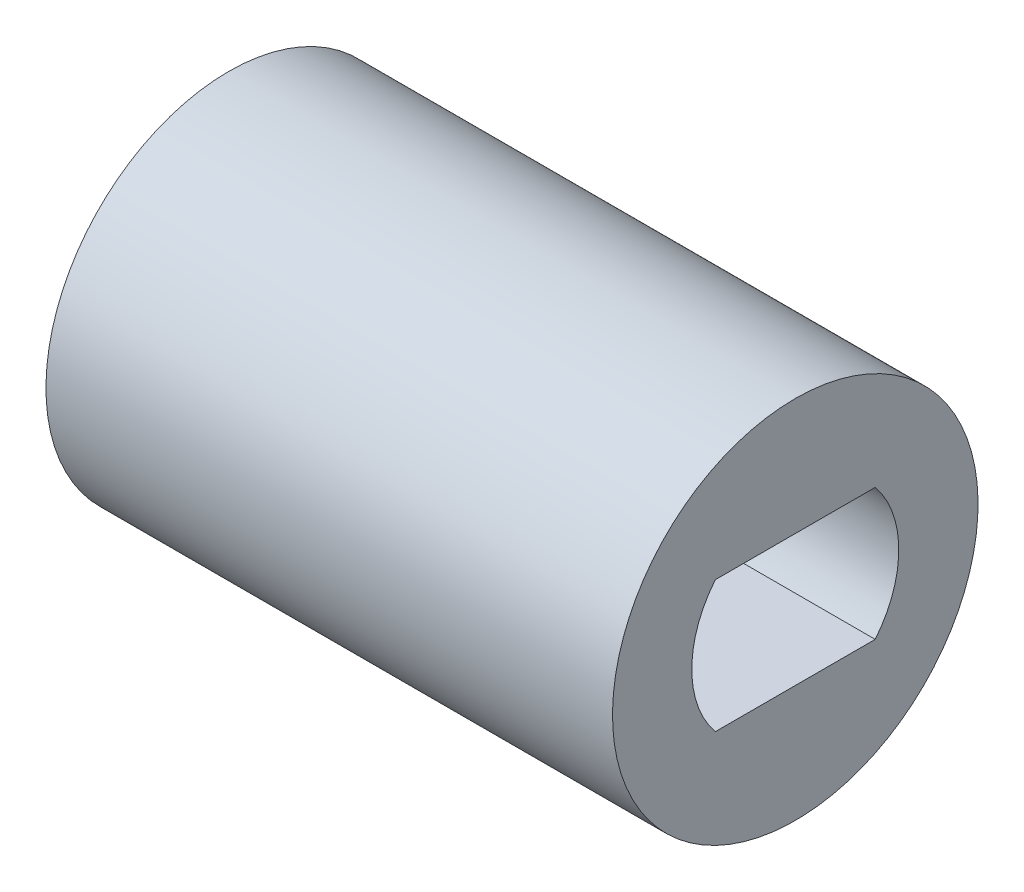
ISO-10303-21;
HEADER;
FILE_DESCRIPTION(('STEP AP214'),'2;1');
FILE_NAME('part.step','',(''),(''),'','','');
FILE_SCHEMA(('AUTOMOTIVE_DESIGN { 1 0 10303 214 1 1 1 1 }'));
ENDSEC;
DATA;
#1=APPLICATION_CONTEXT('core data for automotive mechanical design processes');
#2=APPLICATION_PROTOCOL_DEFINITION('international standard','automotive_design',2000,#1);
#3=PRODUCT_CONTEXT('',#1,'mechanical');
#4=PRODUCT('Part','Part','',(#3));
#5=PRODUCT_RELATED_PRODUCT_CATEGORY('part','',(#4));
#6=PRODUCT_DEFINITION_FORMATION('','',#4);
#7=PRODUCT_DEFINITION_CONTEXT('part definition',#1,'design');
#8=PRODUCT_DEFINITION('design','',#6,#7);
#9=PRODUCT_DEFINITION_SHAPE('','',#8);
#10=(LENGTH_UNIT() NAMED_UNIT(*) SI_UNIT(.MILLI.,.METRE.));
#11=(NAMED_UNIT(*) PLANE_ANGLE_UNIT() SI_UNIT($,.RADIAN.));
#12=(NAMED_UNIT(*) SI_UNIT($,.STERADIAN.) SOLID_ANGLE_UNIT());
#13=UNCERTAINTY_MEASURE_WITH_UNIT(LENGTH_MEASURE(1.E-05),#10,'distance_accuracy_value','');
#14=(GEOMETRIC_REPRESENTATION_CONTEXT(3) GLOBAL_UNCERTAINTY_ASSIGNED_CONTEXT((#13)) GLOBAL_UNIT_ASSIGNED_CONTEXT((#10,
#11,#12)) REPRESENTATION_CONTEXT('',''));
#15=CARTESIAN_POINT('',(0.,0.,0.));
#16=DIRECTION('',(0.,0.,1.));
#17=DIRECTION('',(1.,0.,0.));
#18=AXIS2_PLACEMENT_3D('',#15,#16,#17);
#19=CARTESIAN_POINT('',(60.96,6.35000000000003,0.));
#20=DIRECTION('',(1.,0.,0.));
#21=DIRECTION('',(0.,1.,0.));
#22=AXIS2_PLACEMENT_3D('',#19,#20,#21);
#23=PLANE('',#22);
#24=CARTESIAN_POINT('',(60.96,0.,0.));
#25=DIRECTION('',(1.,0.,0.));
#26=DIRECTION('',(0.,1.,0.));
#27=AXIS2_PLACEMENT_3D('',#24,#25,#26);
#28=CIRCLE('',#27,6.35000000000002);
#29=CARTESIAN_POINT('',(60.96,6.35000000000003,0.));
#30=VERTEX_POINT('',#29);
#31=EDGE_CURVE('E110',#30,#30,#28,.T.);
#32=ORIENTED_EDGE('',*,*,#31,.T.);
#33=EDGE_LOOP('',(#32));
#34=FACE_BOUND('',#33,.T.);
#35=CARTESIAN_POINT('',(60.96,0.,0.));
#36=DIRECTION('',(1.,0.,0.));
#37=DIRECTION('',(0.,0.,-1.));
#38=AXIS2_PLACEMENT_3D('',#35,#36,#37);
#39=CIRCLE('',#38,3.5964868734474);
#40=CARTESIAN_POINT('',(60.96,2.28600000000001,2.77649452203304));
#41=VERTEX_POINT('',#40);
#42=CARTESIAN_POINT('',(60.96,-2.28599999999999,2.77649452203304));
#43=VERTEX_POINT('',#42);
#44=EDGE_CURVE('E103',#41,#43,#39,.T.);
#45=ORIENTED_EDGE('',*,*,#44,.F.);
#46=DIRECTION('',(0.,0.,-1.));
#47=VECTOR('',#46,1.);
#48=CARTESIAN_POINT('',(60.96,2.28600000000001,0.));
#49=LINE('',#48,#47);
#50=CARTESIAN_POINT('',(60.96,2.28600000000001,-2.77649452203304));
#51=VERTEX_POINT('',#50);
#52=EDGE_CURVE('E52',#41,#51,#49,.T.);
#53=ORIENTED_EDGE('',*,*,#52,.T.);
#54=CARTESIAN_POINT('',(60.96,-2.28599999999999,-2.77649452203304));
#55=VERTEX_POINT('',#54);
#56=EDGE_CURVE('E94',#55,#51,#39,.T.);
#57=ORIENTED_EDGE('',*,*,#56,.F.);
#58=DIRECTION('',(0.,0.,-1.));
#59=VECTOR('',#58,1.);
#60=CARTESIAN_POINT('',(60.96,-2.28599999999999,0.));
#61=LINE('',#60,#59);
#62=EDGE_CURVE('E105',#43,#55,#61,.T.);
#63=ORIENTED_EDGE('',*,*,#62,.F.);
#64=EDGE_LOOP('',(#45,#53,#57,#63));
#65=FACE_BOUND('',#64,.T.);
#66=ADVANCED_FACE('F37',(#34,#65),#23,.T.);
#67=CARTESIAN_POINT('',(50.9269999999999,0.,0.));
#68=DIRECTION('',(-1.,0.,0.));
#69=DIRECTION('',(0.,-1.,0.));
#70=AXIS2_PLACEMENT_3D('',#67,#68,#69);
#71=CONICAL_SURFACE('',#70,3.17500000000003,0.785398163397446);
#72=CARTESIAN_POINT('',(54.102,0.,0.));
#73=VERTEX_POINT('',#72);
#74=VERTEX_LOOP('',#73);
#75=FACE_BOUND('',#74,.T.);
#76=CARTESIAN_POINT('',(50.9269999999999,0.,0.));
#77=DIRECTION('',(1.,0.,0.));
#78=DIRECTION('',(0.,1.,0.));
#79=AXIS2_PLACEMENT_3D('',#76,#77,#78);
#80=CIRCLE('',#79,3.17500000000003);
#81=CARTESIAN_POINT('',(50.9269999999999,3.17500000000003,0.));
#82=VERTEX_POINT('',#81);
#83=EDGE_CURVE('E11',#82,#82,#80,.T.);
#84=ORIENTED_EDGE('',*,*,#83,.F.);
#85=EDGE_LOOP('',(#84));
#86=FACE_BOUND('',#85,.T.);
#87=ADVANCED_FACE('F39',(#75,#86),#71,.F.);
#88=CARTESIAN_POINT('',(60.96,0.,0.));
#89=DIRECTION('',(1.,0.,0.));
#90=DIRECTION('',(0.,1.,0.));
#91=AXIS2_PLACEMENT_3D('',#88,#89,#90);
#92=CYLINDRICAL_SURFACE('',#91,3.17500000000003);
#93=ORIENTED_EDGE('',*,*,#83,.T.);
#94=EDGE_LOOP('',(#93));
#95=FACE_BOUND('',#94,.T.);
#96=CARTESIAN_POINT('',(41.2749999999999,0.,0.));
#97=DIRECTION('',(1.,0.,0.));
#98=DIRECTION('',(0.,1.,0.));
#99=AXIS2_PLACEMENT_3D('',#96,#97,#98);
#100=CIRCLE('',#99,3.17500000000003);
#101=CARTESIAN_POINT('',(41.2749999999999,3.17500000000003,0.));
#102=VERTEX_POINT('',#101);
#103=EDGE_CURVE('E45',#102,#102,#100,.T.);
#104=ORIENTED_EDGE('',*,*,#103,.F.);
#105=EDGE_LOOP('',(#104));
#106=FACE_BOUND('',#105,.T.);
#107=ADVANCED_FACE('F124',(#95,#106),#92,.F.);
#108=CARTESIAN_POINT('',(41.2749999999999,6.35000000000003,0.));
#109=DIRECTION('',(-1.,0.,0.));
#110=DIRECTION('',(0.,-1.,0.));
#111=AXIS2_PLACEMENT_3D('',#108,#109,#110);
#112=PLANE('',#111);
#113=ORIENTED_EDGE('',*,*,#103,.T.);
#114=EDGE_LOOP('',(#113));
#115=FACE_BOUND('',#114,.T.);
#116=CARTESIAN_POINT('',(41.2749999999999,0.,0.));
#117=DIRECTION('',(1.,0.,0.));
#118=DIRECTION('',(0.,1.,0.));
#119=AXIS2_PLACEMENT_3D('',#116,#117,#118);
#120=CIRCLE('',#119,6.35000000000003);
#121=CARTESIAN_POINT('',(41.2749999999999,6.35000000000003,0.));
#122=VERTEX_POINT('',#121);
#123=EDGE_CURVE('E116',#122,#122,#120,.T.);
#124=ORIENTED_EDGE('',*,*,#123,.F.);
#125=EDGE_LOOP('',(#124));
#126=FACE_BOUND('',#125,.T.);
#127=ADVANCED_FACE('F121',(#115,#126),#112,.T.);
#128=CARTESIAN_POINT('',(60.96,0.,0.));
#129=DIRECTION('',(1.,0.,0.));
#130=DIRECTION('',(0.,1.,0.));
#131=AXIS2_PLACEMENT_3D('',#128,#129,#130);
#132=CYLINDRICAL_SURFACE('',#131,6.35000000000003);
#133=ORIENTED_EDGE('',*,*,#123,.T.);
#134=EDGE_LOOP('',(#133));
#135=FACE_BOUND('',#134,.T.);
#136=ORIENTED_EDGE('',*,*,#31,.F.);
#137=EDGE_LOOP('',(#136));
#138=FACE_BOUND('',#137,.T.);
#139=ADVANCED_FACE('F131',(#135,#138),#132,.T.);
#140=CARTESIAN_POINT('',(54.356,2.28600000000001,0.));
#141=DIRECTION('',(0.,-1.,0.));
#142=DIRECTION('',(0.,0.,-1.));
#143=AXIS2_PLACEMENT_3D('',#140,#141,#142);
#144=PLANE('',#143);
#145=ORIENTED_EDGE('',*,*,#52,.F.);
#146=DIRECTION('',(1.,0.,0.));
#147=VECTOR('',#146,1.);
#148=CARTESIAN_POINT('',(54.356,2.28600000000001,2.77649452203304));
#149=LINE('',#148,#147);
#150=CARTESIAN_POINT('',(54.356,2.28600000000001,2.77649452203304));
#151=VERTEX_POINT('',#150);
#152=EDGE_CURVE('E75',#151,#41,#149,.T.);
#153=ORIENTED_EDGE('',*,*,#152,.F.);
#154=DIRECTION('',(0.,0.,-1.));
#155=VECTOR('',#154,1.);
#156=CARTESIAN_POINT('',(54.356,2.28600000000001,0.));
#157=LINE('',#156,#155);
#158=CARTESIAN_POINT('',(54.356,2.28600000000001,-2.77649452203304));
#159=VERTEX_POINT('',#158);
#160=EDGE_CURVE('E78',#151,#159,#157,.T.);
#161=ORIENTED_EDGE('',*,*,#160,.T.);
#162=DIRECTION('',(1.,0.,0.));
#163=VECTOR('',#162,1.);
#164=CARTESIAN_POINT('',(54.356,2.28600000000001,-2.77649452203304));
#165=LINE('',#164,#163);
#166=EDGE_CURVE('E108',#159,#51,#165,.T.);
#167=ORIENTED_EDGE('',*,*,#166,.T.);
#168=EDGE_LOOP('',(#145,#153,#161,#167));
#169=FACE_BOUND('',#168,.T.);
#170=ADVANCED_FACE('F77',(#169),#144,.T.);
#171=CARTESIAN_POINT('',(54.356,0.,0.));
#172=DIRECTION('',(1.,0.,0.));
#173=DIRECTION('',(0.,0.,-1.));
#174=AXIS2_PLACEMENT_3D('',#171,#172,#173);
#175=CYLINDRICAL_SURFACE('',#174,3.5964868734474);
#176=ORIENTED_EDGE('',*,*,#56,.T.);
#177=ORIENTED_EDGE('',*,*,#166,.F.);
#178=CARTESIAN_POINT('',(54.356,0.,0.));
#179=DIRECTION('',(1.,0.,0.));
#180=DIRECTION('',(0.,0.,-1.));
#181=AXIS2_PLACEMENT_3D('',#178,#179,#180);
#182=CIRCLE('',#181,3.5964868734474);
#183=CARTESIAN_POINT('',(54.356,-2.28599999999999,-2.77649452203304));
#184=VERTEX_POINT('',#183);
#185=EDGE_CURVE('E85',#184,#159,#182,.T.);
#186=ORIENTED_EDGE('',*,*,#185,.F.);
#187=DIRECTION('',(1.,0.,0.));
#188=VECTOR('',#187,1.);
#189=CARTESIAN_POINT('',(54.356,-2.28599999999999,-2.77649452203304));
#190=LINE('',#189,#188);
#191=EDGE_CURVE('E111',#184,#55,#190,.T.);
#192=ORIENTED_EDGE('',*,*,#191,.T.);
#193=EDGE_LOOP('',(#176,#177,#186,#192));
#194=FACE_BOUND('',#193,.T.);
#195=ADVANCED_FACE('F147',(#194),#175,.F.);
#196=CARTESIAN_POINT('',(54.356,-2.28599999999999,0.));
#197=DIRECTION('',(0.,-1.,0.));
#198=DIRECTION('',(0.,0.,-1.));
#199=AXIS2_PLACEMENT_3D('',#196,#197,#198);
#200=PLANE('',#199);
#201=ORIENTED_EDGE('',*,*,#62,.T.);
#202=ORIENTED_EDGE('',*,*,#191,.F.);
#203=DIRECTION('',(0.,0.,-1.));
#204=VECTOR('',#203,1.);
#205=CARTESIAN_POINT('',(54.356,-2.28599999999999,0.));
#206=LINE('',#205,#204);
#207=CARTESIAN_POINT('',(54.356,-2.28599999999999,2.77649452203304));
#208=VERTEX_POINT('',#207);
#209=EDGE_CURVE('E98',#208,#184,#206,.T.);
#210=ORIENTED_EDGE('',*,*,#209,.F.);
#211=DIRECTION('',(1.,0.,0.));
#212=VECTOR('',#211,1.);
#213=CARTESIAN_POINT('',(54.356,-2.28599999999999,2.77649452203304));
#214=LINE('',#213,#212);
#215=EDGE_CURVE('E84',#208,#43,#214,.T.);
#216=ORIENTED_EDGE('',*,*,#215,.T.);
#217=EDGE_LOOP('',(#201,#202,#210,#216));
#218=FACE_BOUND('',#217,.T.);
#219=ADVANCED_FACE('F154',(#218),#200,.F.);
#220=ORIENTED_EDGE('',*,*,#44,.T.);
#221=ORIENTED_EDGE('',*,*,#215,.F.);
#222=EDGE_CURVE('E92',#151,#208,#182,.T.);
#223=ORIENTED_EDGE('',*,*,#222,.F.);
#224=ORIENTED_EDGE('',*,*,#152,.T.);
#225=EDGE_LOOP('',(#220,#221,#223,#224));
#226=FACE_BOUND('',#225,.T.);
#227=ADVANCED_FACE('F96',(#226),#175,.F.);
#228=CARTESIAN_POINT('',(54.356,0.,0.));
#229=DIRECTION('',(1.,0.,0.));
#230=DIRECTION('',(0.,0.,-1.));
#231=AXIS2_PLACEMENT_3D('',#228,#229,#230);
#232=PLANE('',#231);
#233=ORIENTED_EDGE('',*,*,#160,.F.);
#234=ORIENTED_EDGE('',*,*,#222,.T.);
#235=ORIENTED_EDGE('',*,*,#209,.T.);
#236=ORIENTED_EDGE('',*,*,#185,.T.);
#237=EDGE_LOOP('',(#233,#234,#235,#236));
#238=FACE_BOUND('',#237,.T.);
#239=ADVANCED_FACE('F90',(#238),#232,.T.);
#240=CLOSED_SHELL('',(#66,#87,#107,#127,#139,#170,#195,#219,#227,#239));
#241=MANIFOLD_SOLID_BREP('B2',#240);
#242=ADVANCED_BREP_SHAPE_REPRESENTATION('',(#18,#241),#14);
#243=SHAPE_DEFINITION_REPRESENTATION(#9,#242);
ENDSEC;
END-ISO-10303-21;
